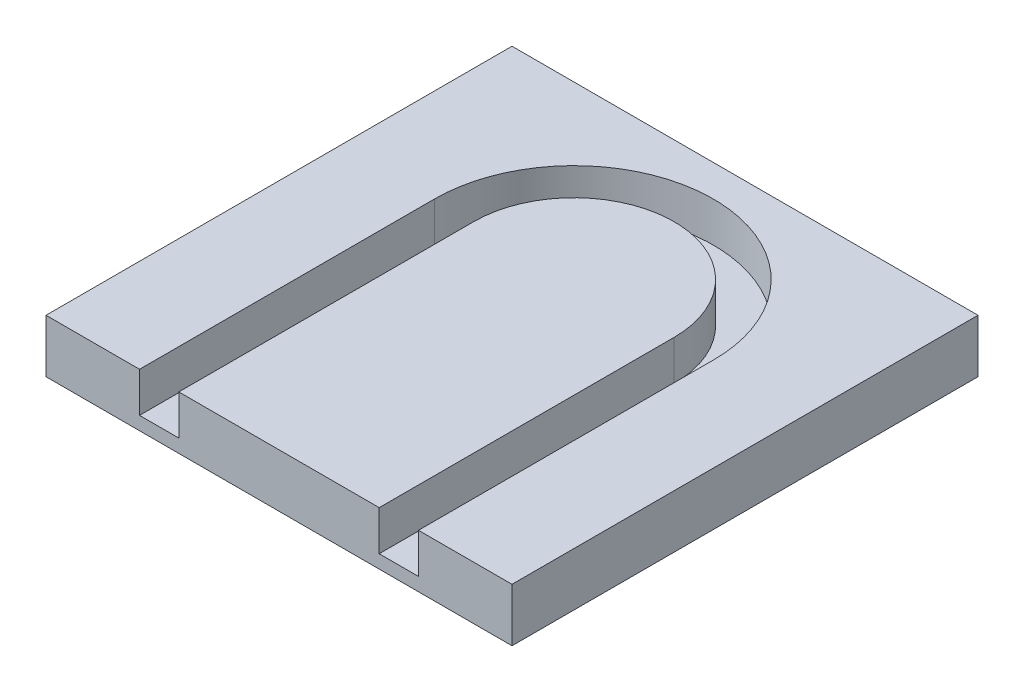
ISO-10303-21;
HEADER;
FILE_DESCRIPTION(('STEP AP214'),'2;1');
FILE_NAME('part.step','',(''),(''),'','','');
FILE_SCHEMA(('AUTOMOTIVE_DESIGN { 1 0 10303 214 1 1 1 1 }'));
ENDSEC;
DATA;
#1=APPLICATION_CONTEXT('core data for automotive mechanical design processes');
#2=APPLICATION_PROTOCOL_DEFINITION('international standard','automotive_design',2000,#1);
#3=PRODUCT_CONTEXT('',#1,'mechanical');
#4=PRODUCT('Part','Part','',(#3));
#5=PRODUCT_RELATED_PRODUCT_CATEGORY('part','',(#4));
#6=PRODUCT_DEFINITION_FORMATION('','',#4);
#7=PRODUCT_DEFINITION_CONTEXT('part definition',#1,'design');
#8=PRODUCT_DEFINITION('design','',#6,#7);
#9=PRODUCT_DEFINITION_SHAPE('','',#8);
#10=(LENGTH_UNIT() NAMED_UNIT(*) SI_UNIT(.MILLI.,.METRE.));
#11=(NAMED_UNIT(*) PLANE_ANGLE_UNIT() SI_UNIT($,.RADIAN.));
#12=(NAMED_UNIT(*) SI_UNIT($,.STERADIAN.) SOLID_ANGLE_UNIT());
#13=UNCERTAINTY_MEASURE_WITH_UNIT(LENGTH_MEASURE(1.E-05),#10,'distance_accuracy_value','');
#14=(GEOMETRIC_REPRESENTATION_CONTEXT(3) GLOBAL_UNCERTAINTY_ASSIGNED_CONTEXT((#13)) GLOBAL_UNIT_ASSIGNED_CONTEXT((#10,
#11,#12)) REPRESENTATION_CONTEXT('',''));
#15=CARTESIAN_POINT('',(0.,0.,0.));
#16=DIRECTION('',(0.,0.,1.));
#17=DIRECTION('',(1.,0.,0.));
#18=AXIS2_PLACEMENT_3D('',#15,#16,#17);
#19=CARTESIAN_POINT('',(0.,1.,0.));
#20=DIRECTION('',(0.,-1.,0.));
#21=DIRECTION('',(0.,0.,-1.));
#22=AXIS2_PLACEMENT_3D('',#19,#20,#21);
#23=PLANE('',#22);
#24=DIRECTION('',(0.,0.,-1.));
#25=VECTOR('',#24,1.);
#26=CARTESIAN_POINT('',(7.525,1.,0.));
#27=LINE('',#26,#25);
#28=CARTESIAN_POINT('',(7.525,1.,17.5));
#29=VERTEX_POINT('',#28);
#30=CARTESIAN_POINT('',(7.525,1.,-4.65042042977267));
#31=VERTEX_POINT('',#30);
#32=EDGE_CURVE('E185',#29,#31,#27,.T.);
#33=ORIENTED_EDGE('',*,*,#32,.F.);
#34=DIRECTION('',(1.,0.,0.));
#35=VECTOR('',#34,1.);
#36=CARTESIAN_POINT('',(-17.5,1.,17.5));
#37=LINE('',#36,#35);
#38=CARTESIAN_POINT('',(10.475,1.,17.5));
#39=VERTEX_POINT('',#38);
#40=EDGE_CURVE('E235',#29,#39,#37,.T.);
#41=ORIENTED_EDGE('',*,*,#40,.T.);
#42=DIRECTION('',(0.,0.,-1.));
#43=VECTOR('',#42,1.);
#44=CARTESIAN_POINT('',(10.475,1.,0.));
#45=LINE('',#44,#43);
#46=CARTESIAN_POINT('',(10.475,1.,-4.65042042977267));
#47=VERTEX_POINT('',#46);
#48=EDGE_CURVE('E189',#39,#47,#45,.T.);
#49=ORIENTED_EDGE('',*,*,#48,.T.);
#50=CARTESIAN_POINT('',(0.,1.,-4.65042042977267));
#51=DIRECTION('',(0.,1.,0.));
#52=DIRECTION('',(0.,0.,1.));
#53=AXIS2_PLACEMENT_3D('',#50,#51,#52);
#54=CIRCLE('',#53,10.475);
#55=CARTESIAN_POINT('',(-10.475,1.,-4.65042042977267));
#56=VERTEX_POINT('',#55);
#57=EDGE_CURVE('E186',#47,#56,#54,.T.);
#58=ORIENTED_EDGE('',*,*,#57,.T.);
#59=DIRECTION('',(0.,0.,-1.));
#60=VECTOR('',#59,1.);
#61=CARTESIAN_POINT('',(-10.475,1.,0.));
#62=LINE('',#61,#60);
#63=CARTESIAN_POINT('',(-10.475,1.,17.5));
#64=VERTEX_POINT('',#63);
#65=EDGE_CURVE('E199',#64,#56,#62,.T.);
#66=ORIENTED_EDGE('',*,*,#65,.F.);
#67=CARTESIAN_POINT('',(-7.52499999999999,1.,17.5));
#68=VERTEX_POINT('',#67);
#69=EDGE_CURVE('E232',#64,#68,#37,.T.);
#70=ORIENTED_EDGE('',*,*,#69,.T.);
#71=DIRECTION('',(0.,0.,-1.));
#72=VECTOR('',#71,1.);
#73=CARTESIAN_POINT('',(-7.52499999999999,1.,0.));
#74=LINE('',#73,#72);
#75=CARTESIAN_POINT('',(-7.52499999999999,1.,-4.65042042977267));
#76=VERTEX_POINT('',#75);
#77=EDGE_CURVE('E95',#68,#76,#74,.T.);
#78=ORIENTED_EDGE('',*,*,#77,.T.);
#79=CARTESIAN_POINT('',(0.,1.,-4.65042042977267));
#80=DIRECTION('',(0.,1.,0.));
#81=DIRECTION('',(0.,0.,1.));
#82=AXIS2_PLACEMENT_3D('',#79,#80,#81);
#83=CIRCLE('',#82,7.52499999999999);
#84=EDGE_CURVE('E90',#31,#76,#83,.T.);
#85=ORIENTED_EDGE('',*,*,#84,.F.);
#86=EDGE_LOOP('',(#33,#41,#49,#58,#66,#70,#78,#85));
#87=FACE_BOUND('',#86,.T.);
#88=ADVANCED_FACE('F75',(#87),#23,.F.);
#89=CARTESIAN_POINT('',(17.5,1.,17.5));
#90=DIRECTION('',(-1.,0.,0.));
#91=DIRECTION('',(0.,0.,1.));
#92=AXIS2_PLACEMENT_3D('',#89,#90,#91);
#93=PLANE('',#92);
#94=DIRECTION('',(0.,0.,-1.));
#95=VECTOR('',#94,1.);
#96=CARTESIAN_POINT('',(17.5,0.,17.5));
#97=LINE('',#96,#95);
#98=CARTESIAN_POINT('',(17.5,0.,17.5));
#99=VERTEX_POINT('',#98);
#100=CARTESIAN_POINT('',(17.5,0.,-17.5));
#101=VERTEX_POINT('',#100);
#102=EDGE_CURVE('E231',#99,#101,#97,.T.);
#103=ORIENTED_EDGE('',*,*,#102,.T.);
#104=DIRECTION('',(0.,-1.,0.));
#105=VECTOR('',#104,1.);
#106=CARTESIAN_POINT('',(17.5,1.,-17.5));
#107=LINE('',#106,#105);
#108=CARTESIAN_POINT('',(17.5,4.,-17.5));
#109=VERTEX_POINT('',#108);
#110=EDGE_CURVE('E12',#109,#101,#107,.T.);
#111=ORIENTED_EDGE('',*,*,#110,.F.);
#112=DIRECTION('',(0.,0.,-1.));
#113=VECTOR('',#112,1.);
#114=CARTESIAN_POINT('',(17.5,4.,0.));
#115=LINE('',#114,#113);
#116=CARTESIAN_POINT('',(17.5,4.,17.5));
#117=VERTEX_POINT('',#116);
#118=EDGE_CURVE('E205',#117,#109,#115,.T.);
#119=ORIENTED_EDGE('',*,*,#118,.F.);
#120=DIRECTION('',(0.,-1.,0.));
#121=VECTOR('',#120,1.);
#122=CARTESIAN_POINT('',(17.5,1.,17.5));
#123=LINE('',#122,#121);
#124=EDGE_CURVE('E234',#117,#99,#123,.T.);
#125=ORIENTED_EDGE('',*,*,#124,.T.);
#126=EDGE_LOOP('',(#103,#111,#119,#125));
#127=FACE_BOUND('',#126,.T.);
#128=ADVANCED_FACE('F77',(#127),#93,.F.);
#129=CARTESIAN_POINT('',(-17.5,1.,-17.5));
#130=DIRECTION('',(0.,0.,1.));
#131=DIRECTION('',(1.,0.,0.));
#132=AXIS2_PLACEMENT_3D('',#129,#130,#131);
#133=PLANE('',#132);
#134=DIRECTION('',(-1.,0.,0.));
#135=VECTOR('',#134,1.);
#136=CARTESIAN_POINT('',(-17.5,0.,-17.5));
#137=LINE('',#136,#135);
#138=CARTESIAN_POINT('',(-17.5,0.,-17.5));
#139=VERTEX_POINT('',#138);
#140=EDGE_CURVE('E238',#101,#139,#137,.T.);
#141=ORIENTED_EDGE('',*,*,#140,.T.);
#142=DIRECTION('',(0.,-1.,0.));
#143=VECTOR('',#142,1.);
#144=CARTESIAN_POINT('',(-17.5,1.,-17.5));
#145=LINE('',#144,#143);
#146=CARTESIAN_POINT('',(-17.5,4.,-17.5));
#147=VERTEX_POINT('',#146);
#148=EDGE_CURVE('E83',#147,#139,#145,.T.);
#149=ORIENTED_EDGE('',*,*,#148,.F.);
#150=DIRECTION('',(-1.,0.,0.));
#151=VECTOR('',#150,1.);
#152=CARTESIAN_POINT('',(0.,4.,-17.5));
#153=LINE('',#152,#151);
#154=EDGE_CURVE('E209',#109,#147,#153,.T.);
#155=ORIENTED_EDGE('',*,*,#154,.F.);
#156=ORIENTED_EDGE('',*,*,#110,.T.);
#157=EDGE_LOOP('',(#141,#149,#155,#156));
#158=FACE_BOUND('',#157,.T.);
#159=ADVANCED_FACE('F269',(#158),#133,.F.);
#160=CARTESIAN_POINT('',(-17.5,1.,17.5));
#161=DIRECTION('',(1.,0.,0.));
#162=DIRECTION('',(0.,0.,-1.));
#163=AXIS2_PLACEMENT_3D('',#160,#161,#162);
#164=PLANE('',#163);
#165=DIRECTION('',(0.,0.,1.));
#166=VECTOR('',#165,1.);
#167=CARTESIAN_POINT('',(-17.5,0.,17.5));
#168=LINE('',#167,#166);
#169=CARTESIAN_POINT('',(-17.5,0.,17.5));
#170=VERTEX_POINT('',#169);
#171=EDGE_CURVE('E240',#139,#170,#168,.T.);
#172=ORIENTED_EDGE('',*,*,#171,.T.);
#173=DIRECTION('',(0.,-1.,0.));
#174=VECTOR('',#173,1.);
#175=CARTESIAN_POINT('',(-17.5,1.,17.5));
#176=LINE('',#175,#174);
#177=CARTESIAN_POINT('',(-17.5,4.,17.5));
#178=VERTEX_POINT('',#177);
#179=EDGE_CURVE('E246',#178,#170,#176,.T.);
#180=ORIENTED_EDGE('',*,*,#179,.F.);
#181=DIRECTION('',(0.,0.,1.));
#182=VECTOR('',#181,1.);
#183=CARTESIAN_POINT('',(-17.5,4.,0.));
#184=LINE('',#183,#182);
#185=EDGE_CURVE('E212',#147,#178,#184,.T.);
#186=ORIENTED_EDGE('',*,*,#185,.F.);
#187=ORIENTED_EDGE('',*,*,#148,.T.);
#188=EDGE_LOOP('',(#172,#180,#186,#187));
#189=FACE_BOUND('',#188,.T.);
#190=ADVANCED_FACE('F252',(#189),#164,.F.);
#191=CARTESIAN_POINT('',(-17.5,1.,17.5));
#192=DIRECTION('',(0.,0.,-1.));
#193=DIRECTION('',(-1.,0.,0.));
#194=AXIS2_PLACEMENT_3D('',#191,#192,#193);
#195=PLANE('',#194);
#196=DIRECTION('',(1.,0.,0.));
#197=VECTOR('',#196,1.);
#198=CARTESIAN_POINT('',(-17.5,0.,17.5));
#199=LINE('',#198,#197);
#200=EDGE_CURVE('E242',#170,#99,#199,.T.);
#201=ORIENTED_EDGE('',*,*,#200,.T.);
#202=ORIENTED_EDGE('',*,*,#124,.F.);
#203=DIRECTION('',(1.,0.,0.));
#204=VECTOR('',#203,1.);
#205=CARTESIAN_POINT('',(0.,4.,17.5));
#206=LINE('',#205,#204);
#207=CARTESIAN_POINT('',(10.475,4.,17.5));
#208=VERTEX_POINT('',#207);
#209=EDGE_CURVE('E202',#208,#117,#206,.T.);
#210=ORIENTED_EDGE('',*,*,#209,.F.);
#211=DIRECTION('',(0.,-1.,0.));
#212=VECTOR('',#211,1.);
#213=CARTESIAN_POINT('',(10.475,4.,17.5));
#214=LINE('',#213,#212);
#215=EDGE_CURVE('E225',#208,#39,#214,.T.);
#216=ORIENTED_EDGE('',*,*,#215,.T.);
#217=ORIENTED_EDGE('',*,*,#40,.F.);
#218=DIRECTION('',(0.,-1.,0.));
#219=VECTOR('',#218,1.);
#220=CARTESIAN_POINT('',(7.525,4.,17.5));
#221=LINE('',#220,#219);
#222=CARTESIAN_POINT('',(7.525,4.,17.5));
#223=VERTEX_POINT('',#222);
#224=EDGE_CURVE('E429',#223,#29,#221,.T.);
#225=ORIENTED_EDGE('',*,*,#224,.F.);
#226=DIRECTION('',(1.,0.,0.));
#227=VECTOR('',#226,1.);
#228=CARTESIAN_POINT('',(0.,4.,17.5));
#229=LINE('',#228,#227);
#230=CARTESIAN_POINT('',(-7.52499999999999,4.,17.5));
#231=VERTEX_POINT('',#230);
#232=EDGE_CURVE('E179',#231,#223,#229,.T.);
#233=ORIENTED_EDGE('',*,*,#232,.F.);
#234=DIRECTION('',(0.,-1.,0.));
#235=VECTOR('',#234,1.);
#236=CARTESIAN_POINT('',(-7.52499999999999,4.,17.5));
#237=LINE('',#236,#235);
#238=EDGE_CURVE('E191',#231,#68,#237,.T.);
#239=ORIENTED_EDGE('',*,*,#238,.T.);
#240=ORIENTED_EDGE('',*,*,#69,.F.);
#241=DIRECTION('',(0.,-1.,0.));
#242=VECTOR('',#241,1.);
#243=CARTESIAN_POINT('',(-10.475,4.,17.5));
#244=LINE('',#243,#242);
#245=CARTESIAN_POINT('',(-10.475,4.,17.5));
#246=VERTEX_POINT('',#245);
#247=EDGE_CURVE('E223',#246,#64,#244,.T.);
#248=ORIENTED_EDGE('',*,*,#247,.F.);
#249=EDGE_CURVE('E206',#178,#246,#206,.T.);
#250=ORIENTED_EDGE('',*,*,#249,.F.);
#251=ORIENTED_EDGE('',*,*,#179,.T.);
#252=EDGE_LOOP('',(#201,#202,#210,#216,#217,#225,#233,#239,#240,#248,#250,#251));
#253=FACE_BOUND('',#252,.T.);
#254=ADVANCED_FACE('F260',(#253),#195,.F.);
#255=CARTESIAN_POINT('',(0.,0.,0.));
#256=DIRECTION('',(0.,-1.,0.));
#257=DIRECTION('',(0.,0.,-1.));
#258=AXIS2_PLACEMENT_3D('',#255,#256,#257);
#259=PLANE('',#258);
#260=ORIENTED_EDGE('',*,*,#102,.F.);
#261=ORIENTED_EDGE('',*,*,#200,.F.);
#262=ORIENTED_EDGE('',*,*,#171,.F.);
#263=ORIENTED_EDGE('',*,*,#140,.F.);
#264=EDGE_LOOP('',(#260,#261,#262,#263));
#265=FACE_BOUND('',#264,.T.);
#266=ADVANCED_FACE('F258',(#265),#259,.T.);
#267=CARTESIAN_POINT('',(0.,4.,-4.65042042977267));
#268=DIRECTION('',(0.,-1.,0.));
#269=DIRECTION('',(0.,0.,-1.));
#270=AXIS2_PLACEMENT_3D('',#267,#268,#269);
#271=CYLINDRICAL_SURFACE('',#270,10.475);
#272=ORIENTED_EDGE('',*,*,#57,.F.);
#273=DIRECTION('',(0.,-1.,0.));
#274=VECTOR('',#273,1.);
#275=CARTESIAN_POINT('',(10.475,4.,-4.65042042977267));
#276=LINE('',#275,#274);
#277=CARTESIAN_POINT('',(10.475,4.,-4.65042042977267));
#278=VERTEX_POINT('',#277);
#279=EDGE_CURVE('E228',#278,#47,#276,.T.);
#280=ORIENTED_EDGE('',*,*,#279,.F.);
#281=CARTESIAN_POINT('',(0.,4.,-4.65042042977267));
#282=DIRECTION('',(0.,1.,0.));
#283=DIRECTION('',(0.,0.,1.));
#284=AXIS2_PLACEMENT_3D('',#281,#282,#283);
#285=CIRCLE('',#284,10.475);
#286=CARTESIAN_POINT('',(-10.475,4.,-4.65042042977267));
#287=VERTEX_POINT('',#286);
#288=EDGE_CURVE('E195',#278,#287,#285,.T.);
#289=ORIENTED_EDGE('',*,*,#288,.T.);
#290=DIRECTION('',(0.,-1.,0.));
#291=VECTOR('',#290,1.);
#292=CARTESIAN_POINT('',(-10.475,4.,-4.65042042977267));
#293=LINE('',#292,#291);
#294=EDGE_CURVE('E216',#287,#56,#293,.T.);
#295=ORIENTED_EDGE('',*,*,#294,.T.);
#296=EDGE_LOOP('',(#272,#280,#289,#295));
#297=FACE_BOUND('',#296,.T.);
#298=ADVANCED_FACE('F282',(#297),#271,.F.);
#299=CARTESIAN_POINT('',(10.475,4.,0.));
#300=DIRECTION('',(-1.,0.,0.));
#301=DIRECTION('',(0.,0.,1.));
#302=AXIS2_PLACEMENT_3D('',#299,#300,#301);
#303=PLANE('',#302);
#304=ORIENTED_EDGE('',*,*,#48,.F.);
#305=ORIENTED_EDGE('',*,*,#215,.F.);
#306=DIRECTION('',(0.,0.,-1.));
#307=VECTOR('',#306,1.);
#308=CARTESIAN_POINT('',(10.475,4.,0.));
#309=LINE('',#308,#307);
#310=EDGE_CURVE('E198',#208,#278,#309,.T.);
#311=ORIENTED_EDGE('',*,*,#310,.T.);
#312=ORIENTED_EDGE('',*,*,#279,.T.);
#313=EDGE_LOOP('',(#304,#305,#311,#312));
#314=FACE_BOUND('',#313,.T.);
#315=ADVANCED_FACE('F301',(#314),#303,.T.);
#316=CARTESIAN_POINT('',(-10.475,4.,0.));
#317=DIRECTION('',(-1.,0.,0.));
#318=DIRECTION('',(0.,0.,1.));
#319=AXIS2_PLACEMENT_3D('',#316,#317,#318);
#320=PLANE('',#319);
#321=ORIENTED_EDGE('',*,*,#65,.T.);
#322=ORIENTED_EDGE('',*,*,#294,.F.);
#323=DIRECTION('',(0.,0.,-1.));
#324=VECTOR('',#323,1.);
#325=CARTESIAN_POINT('',(-10.475,4.,0.));
#326=LINE('',#325,#324);
#327=EDGE_CURVE('E215',#246,#287,#326,.T.);
#328=ORIENTED_EDGE('',*,*,#327,.F.);
#329=ORIENTED_EDGE('',*,*,#247,.T.);
#330=EDGE_LOOP('',(#321,#322,#328,#329));
#331=FACE_BOUND('',#330,.T.);
#332=ADVANCED_FACE('F308',(#331),#320,.F.);
#333=CARTESIAN_POINT('',(0.,4.,0.));
#334=DIRECTION('',(0.,1.,0.));
#335=DIRECTION('',(0.,0.,1.));
#336=AXIS2_PLACEMENT_3D('',#333,#334,#335);
#337=PLANE('',#336);
#338=ORIENTED_EDGE('',*,*,#288,.F.);
#339=ORIENTED_EDGE('',*,*,#310,.F.);
#340=ORIENTED_EDGE('',*,*,#209,.T.);
#341=ORIENTED_EDGE('',*,*,#118,.T.);
#342=ORIENTED_EDGE('',*,*,#154,.T.);
#343=ORIENTED_EDGE('',*,*,#185,.T.);
#344=ORIENTED_EDGE('',*,*,#249,.T.);
#345=ORIENTED_EDGE('',*,*,#327,.T.);
#346=EDGE_LOOP('',(#338,#339,#340,#341,#342,#343,#344,#345));
#347=FACE_BOUND('',#346,.T.);
#348=ADVANCED_FACE('F267',(#347),#337,.T.);
#349=CARTESIAN_POINT('',(7.525,4.,0.));
#350=DIRECTION('',(-1.,0.,0.));
#351=DIRECTION('',(0.,0.,1.));
#352=AXIS2_PLACEMENT_3D('',#349,#350,#351);
#353=PLANE('',#352);
#354=ORIENTED_EDGE('',*,*,#32,.T.);
#355=DIRECTION('',(0.,-1.,0.));
#356=VECTOR('',#355,1.);
#357=CARTESIAN_POINT('',(7.525,4.,-4.65042042977267));
#358=LINE('',#357,#356);
#359=CARTESIAN_POINT('',(7.525,4.,-4.65042042977267));
#360=VERTEX_POINT('',#359);
#361=EDGE_CURVE('E167',#360,#31,#358,.T.);
#362=ORIENTED_EDGE('',*,*,#361,.F.);
#363=DIRECTION('',(0.,0.,-1.));
#364=VECTOR('',#363,1.);
#365=CARTESIAN_POINT('',(7.525,4.,0.));
#366=LINE('',#365,#364);
#367=EDGE_CURVE('E174',#223,#360,#366,.T.);
#368=ORIENTED_EDGE('',*,*,#367,.F.);
#369=ORIENTED_EDGE('',*,*,#224,.T.);
#370=EDGE_LOOP('',(#354,#362,#368,#369));
#371=FACE_BOUND('',#370,.T.);
#372=ADVANCED_FACE('F184',(#371),#353,.F.);
#373=CARTESIAN_POINT('',(0.,4.,-4.65042042977267));
#374=DIRECTION('',(0.,-1.,0.));
#375=DIRECTION('',(0.,0.,-1.));
#376=AXIS2_PLACEMENT_3D('',#373,#374,#375);
#377=CYLINDRICAL_SURFACE('',#376,7.52499999999999);
#378=ORIENTED_EDGE('',*,*,#84,.T.);
#379=DIRECTION('',(0.,-1.,0.));
#380=VECTOR('',#379,1.);
#381=CARTESIAN_POINT('',(-7.52499999999999,4.,-4.65042042977267));
#382=LINE('',#381,#380);
#383=CARTESIAN_POINT('',(-7.52499999999999,4.,-4.65042042977267));
#384=VERTEX_POINT('',#383);
#385=EDGE_CURVE('E169',#384,#76,#382,.T.);
#386=ORIENTED_EDGE('',*,*,#385,.F.);
#387=CARTESIAN_POINT('',(0.,4.,-4.65042042977267));
#388=DIRECTION('',(0.,1.,0.));
#389=DIRECTION('',(0.,0.,1.));
#390=AXIS2_PLACEMENT_3D('',#387,#388,#389);
#391=CIRCLE('',#390,7.52499999999999);
#392=EDGE_CURVE('E163',#360,#384,#391,.T.);
#393=ORIENTED_EDGE('',*,*,#392,.F.);
#394=ORIENTED_EDGE('',*,*,#361,.T.);
#395=EDGE_LOOP('',(#378,#386,#393,#394));
#396=FACE_BOUND('',#395,.T.);
#397=ADVANCED_FACE('F165',(#396),#377,.T.);
#398=CARTESIAN_POINT('',(-7.52499999999999,4.,0.));
#399=DIRECTION('',(-1.,0.,0.));
#400=DIRECTION('',(0.,0.,1.));
#401=AXIS2_PLACEMENT_3D('',#398,#399,#400);
#402=PLANE('',#401);
#403=ORIENTED_EDGE('',*,*,#77,.F.);
#404=ORIENTED_EDGE('',*,*,#238,.F.);
#405=DIRECTION('',(0.,0.,-1.));
#406=VECTOR('',#405,1.);
#407=CARTESIAN_POINT('',(-7.52499999999999,4.,0.));
#408=LINE('',#407,#406);
#409=EDGE_CURVE('E173',#231,#384,#408,.T.);
#410=ORIENTED_EDGE('',*,*,#409,.T.);
#411=ORIENTED_EDGE('',*,*,#385,.T.);
#412=EDGE_LOOP('',(#403,#404,#410,#411));
#413=FACE_BOUND('',#412,.T.);
#414=ADVANCED_FACE('F334',(#413),#402,.T.);
#415=CARTESIAN_POINT('',(0.,4.,0.));
#416=DIRECTION('',(0.,1.,0.));
#417=DIRECTION('',(0.,0.,1.));
#418=AXIS2_PLACEMENT_3D('',#415,#416,#417);
#419=PLANE('',#418);
#420=ORIENTED_EDGE('',*,*,#367,.T.);
#421=ORIENTED_EDGE('',*,*,#392,.T.);
#422=ORIENTED_EDGE('',*,*,#409,.F.);
#423=ORIENTED_EDGE('',*,*,#232,.T.);
#424=EDGE_LOOP('',(#420,#421,#422,#423));
#425=FACE_BOUND('',#424,.T.);
#426=ADVANCED_FACE('F177',(#425),#419,.T.);
#427=CLOSED_SHELL('',(#88,#128,#159,#190,#254,#266,#298,#315,#332,#348,#372,#397,#414,#426));
#428=MANIFOLD_SOLID_BREP('B2',#427);
#429=ADVANCED_BREP_SHAPE_REPRESENTATION('',(#18,#428),#14);
#430=SHAPE_DEFINITION_REPRESENTATION(#9,#429);
ENDSEC;
END-ISO-10303-21;
